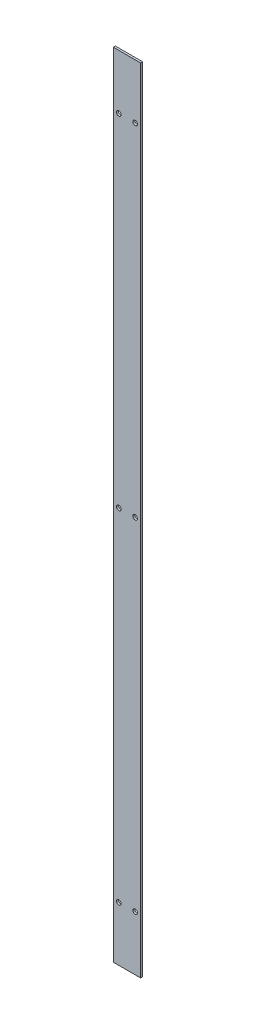
ISO-10303-21;
HEADER;
FILE_DESCRIPTION(('STEP AP214'),'2;1');
FILE_NAME('part.step','',(''),(''),'','','');
FILE_SCHEMA(('AUTOMOTIVE_DESIGN { 1 0 10303 214 1 1 1 1 }'));
ENDSEC;
DATA;
#1=APPLICATION_CONTEXT('core data for automotive mechanical design processes');
#2=APPLICATION_PROTOCOL_DEFINITION('international standard','automotive_design',2000,#1);
#3=PRODUCT_CONTEXT('',#1,'mechanical');
#4=PRODUCT('Part','Part','',(#3));
#5=PRODUCT_RELATED_PRODUCT_CATEGORY('part','',(#4));
#6=PRODUCT_DEFINITION_FORMATION('','',#4);
#7=PRODUCT_DEFINITION_CONTEXT('part definition',#1,'design');
#8=PRODUCT_DEFINITION('design','',#6,#7);
#9=PRODUCT_DEFINITION_SHAPE('','',#8);
#10=(LENGTH_UNIT() NAMED_UNIT(*) SI_UNIT(.MILLI.,.METRE.));
#11=(NAMED_UNIT(*) PLANE_ANGLE_UNIT() SI_UNIT($,.RADIAN.));
#12=(NAMED_UNIT(*) SI_UNIT($,.STERADIAN.) SOLID_ANGLE_UNIT());
#13=UNCERTAINTY_MEASURE_WITH_UNIT(LENGTH_MEASURE(1.E-05),#10,'distance_accuracy_value','');
#14=(GEOMETRIC_REPRESENTATION_CONTEXT(3) GLOBAL_UNCERTAINTY_ASSIGNED_CONTEXT((#13)) GLOBAL_UNIT_ASSIGNED_CONTEXT((#10,
#11,#12)) REPRESENTATION_CONTEXT('',''));
#15=CARTESIAN_POINT('',(0.,0.,0.));
#16=DIRECTION('',(0.,0.,1.));
#17=DIRECTION('',(1.,0.,0.));
#18=AXIS2_PLACEMENT_3D('',#15,#16,#17);
#19=CARTESIAN_POINT('',(-150.5,290.,108.5));
#20=DIRECTION('',(-1.,0.,0.));
#21=DIRECTION('',(0.,0.,1.));
#22=AXIS2_PLACEMENT_3D('',#19,#20,#21);
#23=PLANE('',#22);
#24=DIRECTION('',(0.,-1.,0.));
#25=VECTOR('',#24,1.);
#26=CARTESIAN_POINT('',(-150.5,290.,110.));
#27=LINE('',#26,#25);
#28=CARTESIAN_POINT('',(-150.5,290.,110.));
#29=VERTEX_POINT('',#28);
#30=CARTESIAN_POINT('',(-150.5,-290.,110.));
#31=VERTEX_POINT('',#30);
#32=EDGE_CURVE('E106',#29,#31,#27,.T.);
#33=ORIENTED_EDGE('',*,*,#32,.F.);
#34=DIRECTION('',(0.,0.,1.));
#35=VECTOR('',#34,1.);
#36=CARTESIAN_POINT('',(-150.5,290.,108.5));
#37=LINE('',#36,#35);
#38=CARTESIAN_POINT('',(-150.5,290.,108.5));
#39=VERTEX_POINT('',#38);
#40=EDGE_CURVE('E11',#39,#29,#37,.T.);
#41=ORIENTED_EDGE('',*,*,#40,.F.);
#42=DIRECTION('',(0.,-1.,0.));
#43=VECTOR('',#42,1.);
#44=CARTESIAN_POINT('',(-150.5,290.,108.5));
#45=LINE('',#44,#43);
#46=CARTESIAN_POINT('',(-150.5,-290.,108.5));
#47=VERTEX_POINT('',#46);
#48=EDGE_CURVE('E97',#39,#47,#45,.T.);
#49=ORIENTED_EDGE('',*,*,#48,.T.);
#50=DIRECTION('',(0.,0.,1.));
#51=VECTOR('',#50,1.);
#52=CARTESIAN_POINT('',(-150.5,-290.,108.5));
#53=LINE('',#52,#51);
#54=EDGE_CURVE('E42',#47,#31,#53,.T.);
#55=ORIENTED_EDGE('',*,*,#54,.T.);
#56=EDGE_LOOP('',(#33,#41,#49,#55));
#57=FACE_BOUND('',#56,.T.);
#58=ADVANCED_FACE('F41',(#57),#23,.T.);
#59=CARTESIAN_POINT('',(-150.5,290.,108.5));
#60=DIRECTION('',(0.,1.,0.));
#61=DIRECTION('',(0.,0.,1.));
#62=AXIS2_PLACEMENT_3D('',#59,#60,#61);
#63=PLANE('',#62);
#64=DIRECTION('',(-1.,0.,0.));
#65=VECTOR('',#64,1.);
#66=CARTESIAN_POINT('',(-150.5,290.,110.));
#67=LINE('',#66,#65);
#68=CARTESIAN_POINT('',(-130.5,290.,110.));
#69=VERTEX_POINT('',#68);
#70=EDGE_CURVE('E101',#69,#29,#67,.T.);
#71=ORIENTED_EDGE('',*,*,#70,.F.);
#72=DIRECTION('',(0.,0.,1.));
#73=VECTOR('',#72,1.);
#74=CARTESIAN_POINT('',(-130.5,290.,108.5));
#75=LINE('',#74,#73);
#76=CARTESIAN_POINT('',(-130.5,290.,108.5));
#77=VERTEX_POINT('',#76);
#78=EDGE_CURVE('E49',#77,#69,#75,.T.);
#79=ORIENTED_EDGE('',*,*,#78,.F.);
#80=DIRECTION('',(-1.,0.,0.));
#81=VECTOR('',#80,1.);
#82=CARTESIAN_POINT('',(-150.5,290.,108.5));
#83=LINE('',#82,#81);
#84=EDGE_CURVE('E96',#77,#39,#83,.T.);
#85=ORIENTED_EDGE('',*,*,#84,.T.);
#86=ORIENTED_EDGE('',*,*,#40,.T.);
#87=EDGE_LOOP('',(#71,#79,#85,#86));
#88=FACE_BOUND('',#87,.T.);
#89=ADVANCED_FACE('F120',(#88),#63,.T.);
#90=CARTESIAN_POINT('',(-130.5,290.,108.5));
#91=DIRECTION('',(1.,0.,0.));
#92=DIRECTION('',(0.,0.,-1.));
#93=AXIS2_PLACEMENT_3D('',#90,#91,#92);
#94=PLANE('',#93);
#95=DIRECTION('',(0.,1.,0.));
#96=VECTOR('',#95,1.);
#97=CARTESIAN_POINT('',(-130.5,290.,110.));
#98=LINE('',#97,#96);
#99=CARTESIAN_POINT('',(-130.5,-290.,110.));
#100=VERTEX_POINT('',#99);
#101=EDGE_CURVE('E93',#100,#69,#98,.T.);
#102=ORIENTED_EDGE('',*,*,#101,.F.);
#103=DIRECTION('',(0.,0.,1.));
#104=VECTOR('',#103,1.);
#105=CARTESIAN_POINT('',(-130.5,-290.,108.5));
#106=LINE('',#105,#104);
#107=CARTESIAN_POINT('',(-130.5,-290.,108.5));
#108=VERTEX_POINT('',#107);
#109=EDGE_CURVE('E88',#108,#100,#106,.T.);
#110=ORIENTED_EDGE('',*,*,#109,.F.);
#111=DIRECTION('',(0.,1.,0.));
#112=VECTOR('',#111,1.);
#113=CARTESIAN_POINT('',(-130.5,290.,108.5));
#114=LINE('',#113,#112);
#115=EDGE_CURVE('E90',#108,#77,#114,.T.);
#116=ORIENTED_EDGE('',*,*,#115,.T.);
#117=ORIENTED_EDGE('',*,*,#78,.T.);
#118=EDGE_LOOP('',(#102,#110,#116,#117));
#119=FACE_BOUND('',#118,.T.);
#120=ADVANCED_FACE('F86',(#119),#94,.T.);
#121=CARTESIAN_POINT('',(-150.5,-290.,108.5));
#122=DIRECTION('',(0.,-1.,0.));
#123=DIRECTION('',(0.,0.,-1.));
#124=AXIS2_PLACEMENT_3D('',#121,#122,#123);
#125=PLANE('',#124);
#126=DIRECTION('',(1.,0.,0.));
#127=VECTOR('',#126,1.);
#128=CARTESIAN_POINT('',(-150.5,-290.,110.));
#129=LINE('',#128,#127);
#130=EDGE_CURVE('E108',#31,#100,#129,.T.);
#131=ORIENTED_EDGE('',*,*,#130,.F.);
#132=ORIENTED_EDGE('',*,*,#54,.F.);
#133=DIRECTION('',(1.,0.,0.));
#134=VECTOR('',#133,1.);
#135=CARTESIAN_POINT('',(-150.5,-290.,108.5));
#136=LINE('',#135,#134);
#137=EDGE_CURVE('E92',#47,#108,#136,.T.);
#138=ORIENTED_EDGE('',*,*,#137,.T.);
#139=ORIENTED_EDGE('',*,*,#109,.T.);
#140=EDGE_LOOP('',(#131,#132,#138,#139));
#141=FACE_BOUND('',#140,.T.);
#142=ADVANCED_FACE('F98',(#141),#125,.T.);
#143=CARTESIAN_POINT('',(0.,0.,108.5));
#144=DIRECTION('',(0.,0.,1.));
#145=DIRECTION('',(1.,0.,0.));
#146=AXIS2_PLACEMENT_3D('',#143,#144,#145);
#147=PLANE('',#146);
#148=CARTESIAN_POINT('',(-134.5,250.,108.5));
#149=DIRECTION('',(0.,0.,1.));
#150=DIRECTION('',(1.,0.,0.));
#151=AXIS2_PLACEMENT_3D('',#148,#149,#150);
#152=CIRCLE('',#151,1.70000000000001);
#153=CARTESIAN_POINT('',(-132.8,250.,108.5));
#154=VERTEX_POINT('',#153);
#155=EDGE_CURVE('E167',#154,#154,#152,.T.);
#156=ORIENTED_EDGE('',*,*,#155,.T.);
#157=EDGE_LOOP('',(#156));
#158=FACE_BOUND('',#157,.T.);
#159=CARTESIAN_POINT('',(-134.5,0.,108.5));
#160=DIRECTION('',(0.,0.,1.));
#161=DIRECTION('',(1.,0.,0.));
#162=AXIS2_PLACEMENT_3D('',#159,#160,#161);
#163=CIRCLE('',#162,1.70000000000001);
#164=CARTESIAN_POINT('',(-132.8,0.,108.5));
#165=VERTEX_POINT('',#164);
#166=EDGE_CURVE('E171',#165,#165,#163,.T.);
#167=ORIENTED_EDGE('',*,*,#166,.T.);
#168=EDGE_LOOP('',(#167));
#169=FACE_BOUND('',#168,.T.);
#170=CARTESIAN_POINT('',(-146.5,250.,108.5));
#171=DIRECTION('',(0.,0.,1.));
#172=DIRECTION('',(1.,0.,0.));
#173=AXIS2_PLACEMENT_3D('',#170,#171,#172);
#174=CIRCLE('',#173,1.70000000000001);
#175=CARTESIAN_POINT('',(-144.8,250.,108.5));
#176=VERTEX_POINT('',#175);
#177=EDGE_CURVE('E178',#176,#176,#174,.T.);
#178=ORIENTED_EDGE('',*,*,#177,.T.);
#179=EDGE_LOOP('',(#178));
#180=FACE_BOUND('',#179,.T.);
#181=CARTESIAN_POINT('',(-146.5,0.,108.5));
#182=DIRECTION('',(0.,0.,1.));
#183=DIRECTION('',(1.,0.,0.));
#184=AXIS2_PLACEMENT_3D('',#181,#182,#183);
#185=CIRCLE('',#184,1.70000000000001);
#186=CARTESIAN_POINT('',(-144.8,0.,108.5));
#187=VERTEX_POINT('',#186);
#188=EDGE_CURVE('E187',#187,#187,#185,.T.);
#189=ORIENTED_EDGE('',*,*,#188,.T.);
#190=EDGE_LOOP('',(#189));
#191=FACE_BOUND('',#190,.T.);
#192=CARTESIAN_POINT('',(-134.5,-250.,108.5));
#193=DIRECTION('',(0.,0.,1.));
#194=DIRECTION('',(1.,0.,0.));
#195=AXIS2_PLACEMENT_3D('',#192,#193,#194);
#196=CIRCLE('',#195,1.70000000000001);
#197=CARTESIAN_POINT('',(-132.8,-250.,108.5));
#198=VERTEX_POINT('',#197);
#199=EDGE_CURVE('E195',#198,#198,#196,.T.);
#200=ORIENTED_EDGE('',*,*,#199,.T.);
#201=EDGE_LOOP('',(#200));
#202=FACE_BOUND('',#201,.T.);
#203=CARTESIAN_POINT('',(-146.5,-250.,108.5));
#204=DIRECTION('',(0.,0.,1.));
#205=DIRECTION('',(1.,0.,0.));
#206=AXIS2_PLACEMENT_3D('',#203,#204,#205);
#207=CIRCLE('',#206,1.70000000000001);
#208=CARTESIAN_POINT('',(-144.8,-250.,108.5));
#209=VERTEX_POINT('',#208);
#210=EDGE_CURVE('E109',#209,#209,#207,.T.);
#211=ORIENTED_EDGE('',*,*,#210,.T.);
#212=EDGE_LOOP('',(#211));
#213=FACE_BOUND('',#212,.T.);
#214=ORIENTED_EDGE('',*,*,#48,.F.);
#215=ORIENTED_EDGE('',*,*,#84,.F.);
#216=ORIENTED_EDGE('',*,*,#115,.F.);
#217=ORIENTED_EDGE('',*,*,#137,.F.);
#218=EDGE_LOOP('',(#214,#215,#216,#217));
#219=FACE_BOUND('',#218,.T.);
#220=ADVANCED_FACE('F94',(#158,#169,#180,#191,#202,#213,#219),#147,.F.);
#221=CARTESIAN_POINT('',(0.,0.,110.));
#222=DIRECTION('',(0.,0.,1.));
#223=DIRECTION('',(1.,0.,0.));
#224=AXIS2_PLACEMENT_3D('',#221,#222,#223);
#225=PLANE('',#224);
#226=CARTESIAN_POINT('',(-134.5,250.,110.));
#227=DIRECTION('',(0.,0.,1.));
#228=DIRECTION('',(1.,0.,0.));
#229=AXIS2_PLACEMENT_3D('',#226,#227,#228);
#230=CIRCLE('',#229,1.70000000000001);
#231=CARTESIAN_POINT('',(-132.8,250.,110.));
#232=VERTEX_POINT('',#231);
#233=EDGE_CURVE('E166',#232,#232,#230,.T.);
#234=ORIENTED_EDGE('',*,*,#233,.F.);
#235=EDGE_LOOP('',(#234));
#236=FACE_BOUND('',#235,.T.);
#237=CARTESIAN_POINT('',(-134.5,0.,110.));
#238=DIRECTION('',(0.,0.,1.));
#239=DIRECTION('',(1.,0.,0.));
#240=AXIS2_PLACEMENT_3D('',#237,#238,#239);
#241=CIRCLE('',#240,1.70000000000001);
#242=CARTESIAN_POINT('',(-132.8,0.,110.));
#243=VERTEX_POINT('',#242);
#244=EDGE_CURVE('E172',#243,#243,#241,.T.);
#245=ORIENTED_EDGE('',*,*,#244,.F.);
#246=EDGE_LOOP('',(#245));
#247=FACE_BOUND('',#246,.T.);
#248=CARTESIAN_POINT('',(-146.5,250.,110.));
#249=DIRECTION('',(0.,0.,1.));
#250=DIRECTION('',(1.,0.,0.));
#251=AXIS2_PLACEMENT_3D('',#248,#249,#250);
#252=CIRCLE('',#251,1.70000000000001);
#253=CARTESIAN_POINT('',(-144.8,250.,110.));
#254=VERTEX_POINT('',#253);
#255=EDGE_CURVE('E180',#254,#254,#252,.T.);
#256=ORIENTED_EDGE('',*,*,#255,.F.);
#257=EDGE_LOOP('',(#256));
#258=FACE_BOUND('',#257,.T.);
#259=CARTESIAN_POINT('',(-146.5,0.,110.));
#260=DIRECTION('',(0.,0.,1.));
#261=DIRECTION('',(1.,0.,0.));
#262=AXIS2_PLACEMENT_3D('',#259,#260,#261);
#263=CIRCLE('',#262,1.70000000000001);
#264=CARTESIAN_POINT('',(-144.8,0.,110.));
#265=VERTEX_POINT('',#264);
#266=EDGE_CURVE('E181',#265,#265,#263,.T.);
#267=ORIENTED_EDGE('',*,*,#266,.F.);
#268=EDGE_LOOP('',(#267));
#269=FACE_BOUND('',#268,.T.);
#270=CARTESIAN_POINT('',(-134.5,-250.,110.));
#271=DIRECTION('',(0.,0.,1.));
#272=DIRECTION('',(1.,0.,0.));
#273=AXIS2_PLACEMENT_3D('',#270,#271,#272);
#274=CIRCLE('',#273,1.70000000000001);
#275=CARTESIAN_POINT('',(-132.8,-250.,110.));
#276=VERTEX_POINT('',#275);
#277=EDGE_CURVE('E186',#276,#276,#274,.T.);
#278=ORIENTED_EDGE('',*,*,#277,.F.);
#279=EDGE_LOOP('',(#278));
#280=FACE_BOUND('',#279,.T.);
#281=CARTESIAN_POINT('',(-146.5,-250.,110.));
#282=DIRECTION('',(0.,0.,1.));
#283=DIRECTION('',(1.,0.,0.));
#284=AXIS2_PLACEMENT_3D('',#281,#282,#283);
#285=CIRCLE('',#284,1.70000000000001);
#286=CARTESIAN_POINT('',(-144.8,-250.,110.));
#287=VERTEX_POINT('',#286);
#288=EDGE_CURVE('E193',#287,#287,#285,.T.);
#289=ORIENTED_EDGE('',*,*,#288,.F.);
#290=EDGE_LOOP('',(#289));
#291=FACE_BOUND('',#290,.T.);
#292=ORIENTED_EDGE('',*,*,#32,.T.);
#293=ORIENTED_EDGE('',*,*,#130,.T.);
#294=ORIENTED_EDGE('',*,*,#101,.T.);
#295=ORIENTED_EDGE('',*,*,#70,.T.);
#296=EDGE_LOOP('',(#292,#293,#294,#295));
#297=FACE_BOUND('',#296,.T.);
#298=ADVANCED_FACE('F117',(#236,#247,#258,#269,#280,#291,#297),#225,.T.);
#299=CARTESIAN_POINT('',(-146.5,-250.,108.5));
#300=DIRECTION('',(0.,0.,1.));
#301=DIRECTION('',(1.,0.,0.));
#302=AXIS2_PLACEMENT_3D('',#299,#300,#301);
#303=CYLINDRICAL_SURFACE('',#302,1.70000000000001);
#304=ORIENTED_EDGE('',*,*,#210,.F.);
#305=EDGE_LOOP('',(#304));
#306=FACE_BOUND('',#305,.T.);
#307=ORIENTED_EDGE('',*,*,#288,.T.);
#308=EDGE_LOOP('',(#307));
#309=FACE_BOUND('',#308,.T.);
#310=ADVANCED_FACE('F133',(#306,#309),#303,.F.);
#311=CARTESIAN_POINT('',(-134.5,-250.,108.5));
#312=DIRECTION('',(0.,0.,1.));
#313=DIRECTION('',(1.,0.,0.));
#314=AXIS2_PLACEMENT_3D('',#311,#312,#313);
#315=CYLINDRICAL_SURFACE('',#314,1.70000000000001);
#316=ORIENTED_EDGE('',*,*,#199,.F.);
#317=EDGE_LOOP('',(#316));
#318=FACE_BOUND('',#317,.T.);
#319=ORIENTED_EDGE('',*,*,#277,.T.);
#320=EDGE_LOOP('',(#319));
#321=FACE_BOUND('',#320,.T.);
#322=ADVANCED_FACE('F142',(#318,#321),#315,.F.);
#323=CARTESIAN_POINT('',(-146.5,0.,108.5));
#324=DIRECTION('',(0.,0.,1.));
#325=DIRECTION('',(1.,0.,0.));
#326=AXIS2_PLACEMENT_3D('',#323,#324,#325);
#327=CYLINDRICAL_SURFACE('',#326,1.70000000000001);
#328=ORIENTED_EDGE('',*,*,#188,.F.);
#329=EDGE_LOOP('',(#328));
#330=FACE_BOUND('',#329,.T.);
#331=ORIENTED_EDGE('',*,*,#266,.T.);
#332=EDGE_LOOP('',(#331));
#333=FACE_BOUND('',#332,.T.);
#334=ADVANCED_FACE('F148',(#330,#333),#327,.F.);
#335=CARTESIAN_POINT('',(-146.5,250.,108.5));
#336=DIRECTION('',(0.,0.,1.));
#337=DIRECTION('',(1.,0.,0.));
#338=AXIS2_PLACEMENT_3D('',#335,#336,#337);
#339=CYLINDRICAL_SURFACE('',#338,1.70000000000001);
#340=ORIENTED_EDGE('',*,*,#177,.F.);
#341=EDGE_LOOP('',(#340));
#342=FACE_BOUND('',#341,.T.);
#343=ORIENTED_EDGE('',*,*,#255,.T.);
#344=EDGE_LOOP('',(#343));
#345=FACE_BOUND('',#344,.T.);
#346=ADVANCED_FACE('F147',(#342,#345),#339,.F.);
#347=CARTESIAN_POINT('',(-134.5,0.,108.5));
#348=DIRECTION('',(0.,0.,1.));
#349=DIRECTION('',(1.,0.,0.));
#350=AXIS2_PLACEMENT_3D('',#347,#348,#349);
#351=CYLINDRICAL_SURFACE('',#350,1.70000000000001);
#352=ORIENTED_EDGE('',*,*,#166,.F.);
#353=EDGE_LOOP('',(#352));
#354=FACE_BOUND('',#353,.T.);
#355=ORIENTED_EDGE('',*,*,#244,.T.);
#356=EDGE_LOOP('',(#355));
#357=FACE_BOUND('',#356,.T.);
#358=ADVANCED_FACE('F152',(#354,#357),#351,.F.);
#359=CARTESIAN_POINT('',(-134.5,250.,108.5));
#360=DIRECTION('',(0.,0.,1.));
#361=DIRECTION('',(1.,0.,0.));
#362=AXIS2_PLACEMENT_3D('',#359,#360,#361);
#363=CYLINDRICAL_SURFACE('',#362,1.70000000000001);
#364=ORIENTED_EDGE('',*,*,#155,.F.);
#365=EDGE_LOOP('',(#364));
#366=FACE_BOUND('',#365,.T.);
#367=ORIENTED_EDGE('',*,*,#233,.T.);
#368=EDGE_LOOP('',(#367));
#369=FACE_BOUND('',#368,.T.);
#370=ADVANCED_FACE('F158',(#366,#369),#363,.F.);
#371=CLOSED_SHELL('',(#58,#89,#120,#142,#220,#298,#310,#322,#334,#346,#358,#370));
#372=MANIFOLD_SOLID_BREP('B2',#371);
#373=ADVANCED_BREP_SHAPE_REPRESENTATION('',(#18,#372),#14);
#374=SHAPE_DEFINITION_REPRESENTATION(#9,#373);
ENDSEC;
END-ISO-10303-21;
